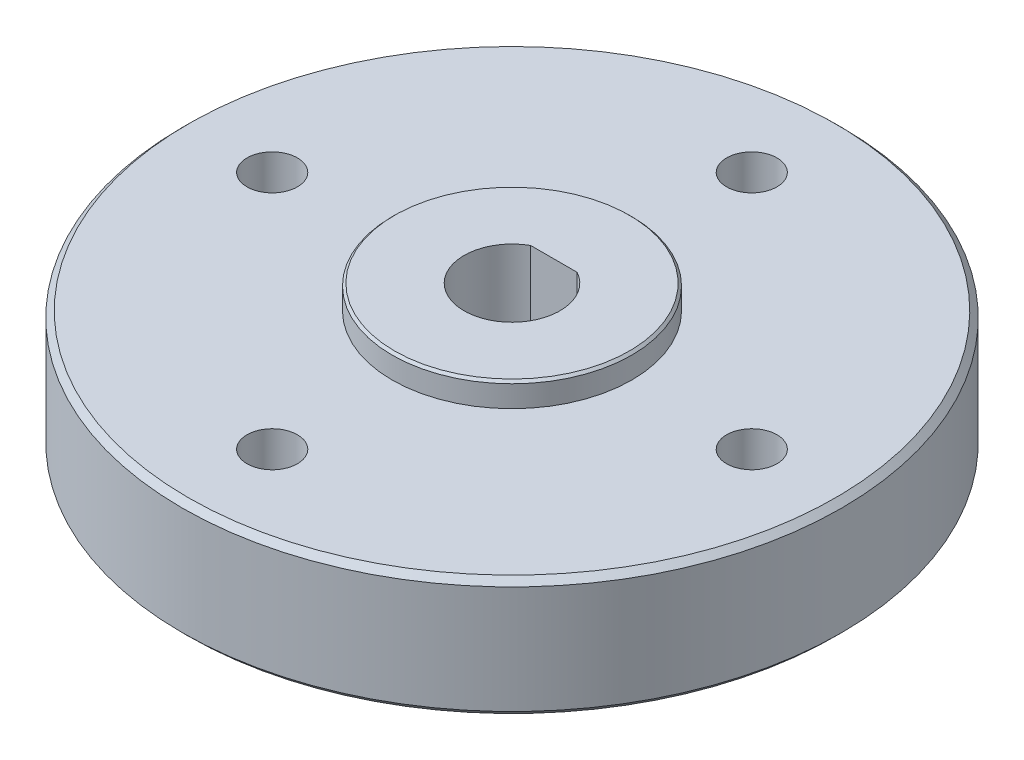
ISO-10303-21;
HEADER;
FILE_DESCRIPTION(('STEP AP214'),'2;1');
FILE_NAME('part.step','',(''),(''),'','','');
FILE_SCHEMA(('AUTOMOTIVE_DESIGN { 1 0 10303 214 1 1 1 1 }'));
ENDSEC;
DATA;
#1=APPLICATION_CONTEXT('core data for automotive mechanical design processes');
#2=APPLICATION_PROTOCOL_DEFINITION('international standard','automotive_design',2000,#1);
#3=PRODUCT_CONTEXT('',#1,'mechanical');
#4=PRODUCT('Part','Part','',(#3));
#5=PRODUCT_RELATED_PRODUCT_CATEGORY('part','',(#4));
#6=PRODUCT_DEFINITION_FORMATION('','',#4);
#7=PRODUCT_DEFINITION_CONTEXT('part definition',#1,'design');
#8=PRODUCT_DEFINITION('design','',#6,#7);
#9=PRODUCT_DEFINITION_SHAPE('','',#8);
#10=(LENGTH_UNIT() NAMED_UNIT(*) SI_UNIT(.MILLI.,.METRE.));
#11=(NAMED_UNIT(*) PLANE_ANGLE_UNIT() SI_UNIT($,.RADIAN.));
#12=(NAMED_UNIT(*) SI_UNIT($,.STERADIAN.) SOLID_ANGLE_UNIT());
#13=UNCERTAINTY_MEASURE_WITH_UNIT(LENGTH_MEASURE(1.E-05),#10,'distance_accuracy_value','');
#14=(GEOMETRIC_REPRESENTATION_CONTEXT(3) GLOBAL_UNCERTAINTY_ASSIGNED_CONTEXT((#13)) GLOBAL_UNIT_ASSIGNED_CONTEXT((#10,
#11,#12)) REPRESENTATION_CONTEXT('',''));
#15=CARTESIAN_POINT('',(0.,0.,0.));
#16=DIRECTION('',(0.,0.,1.));
#17=DIRECTION('',(1.,0.,0.));
#18=AXIS2_PLACEMENT_3D('',#15,#16,#17);
#19=CARTESIAN_POINT('',(0.,20.,0.));
#20=DIRECTION('',(0.,1.,0.));
#21=DIRECTION('',(0.,0.,1.));
#22=AXIS2_PLACEMENT_3D('',#19,#20,#21);
#23=PLANE('',#22);
#24=CARTESIAN_POINT('',(0.,20.,0.));
#25=DIRECTION('',(0.,1.,0.));
#26=DIRECTION('',(0.,0.,1.));
#27=AXIS2_PLACEMENT_3D('',#24,#25,#26);
#28=CIRCLE('',#27,27.);
#29=CARTESIAN_POINT('',(0.,20.,27.));
#30=VERTEX_POINT('',#29);
#31=EDGE_CURVE('E193',#30,#30,#28,.T.);
#32=ORIENTED_EDGE('',*,*,#31,.T.);
#33=EDGE_LOOP('',(#32));
#34=FACE_BOUND('',#33,.T.);
#35=CARTESIAN_POINT('',(20.,20.,2.09488880330588E-13));
#36=DIRECTION('',(0.,1.,0.));
#37=DIRECTION('',(0.,0.,1.));
#38=AXIS2_PLACEMENT_3D('',#35,#36,#37);
#39=CIRCLE('',#38,2.09999999999999);
#40=CARTESIAN_POINT('',(20.,20.,2.1000000000002));
#41=VERTEX_POINT('',#40);
#42=EDGE_CURVE('E430',#41,#41,#39,.T.);
#43=ORIENTED_EDGE('',*,*,#42,.F.);
#44=EDGE_LOOP('',(#43));
#45=FACE_BOUND('',#44,.T.);
#46=CARTESIAN_POINT('',(0.,20.,-20.));
#47=DIRECTION('',(0.,1.,0.));
#48=DIRECTION('',(0.,0.,1.));
#49=AXIS2_PLACEMENT_3D('',#46,#47,#48);
#50=CIRCLE('',#49,2.09999999999999);
#51=CARTESIAN_POINT('',(0.,20.,-17.9));
#52=VERTEX_POINT('',#51);
#53=EDGE_CURVE('E410',#52,#52,#50,.T.);
#54=ORIENTED_EDGE('',*,*,#53,.F.);
#55=EDGE_LOOP('',(#54));
#56=FACE_BOUND('',#55,.T.);
#57=CARTESIAN_POINT('',(-20.,20.,0.));
#58=DIRECTION('',(0.,1.,0.));
#59=DIRECTION('',(0.,0.,1.));
#60=AXIS2_PLACEMENT_3D('',#57,#58,#59);
#61=CIRCLE('',#60,2.09999999999999);
#62=CARTESIAN_POINT('',(-20.,20.,2.09999999999992));
#63=VERTEX_POINT('',#62);
#64=EDGE_CURVE('E412',#63,#63,#61,.T.);
#65=ORIENTED_EDGE('',*,*,#64,.F.);
#66=EDGE_LOOP('',(#65));
#67=FACE_BOUND('',#66,.T.);
#68=CARTESIAN_POINT('',(0.,20.,20.));
#69=DIRECTION('',(0.,1.,0.));
#70=DIRECTION('',(0.,0.,1.));
#71=AXIS2_PLACEMENT_3D('',#68,#69,#70);
#72=CIRCLE('',#71,2.09999999999999);
#73=CARTESIAN_POINT('',(0.,20.,22.1));
#74=VERTEX_POINT('',#73);
#75=EDGE_CURVE('E108',#74,#74,#72,.T.);
#76=ORIENTED_EDGE('',*,*,#75,.F.);
#77=EDGE_LOOP('',(#76));
#78=FACE_BOUND('',#77,.T.);
#79=CARTESIAN_POINT('',(0.,20.,0.));
#80=DIRECTION('',(0.,1.,0.));
#81=DIRECTION('',(0.,0.,1.));
#82=AXIS2_PLACEMENT_3D('',#79,#80,#81);
#83=CIRCLE('',#82,10.);
#84=CARTESIAN_POINT('',(0.,20.,10.));
#85=VERTEX_POINT('',#84);
#86=EDGE_CURVE('E100',#85,#85,#83,.T.);
#87=ORIENTED_EDGE('',*,*,#86,.F.);
#88=EDGE_LOOP('',(#87));
#89=FACE_BOUND('',#88,.T.);
#90=ADVANCED_FACE('F38',(#34,#45,#56,#67,#78,#89),#23,.T.);
#91=CARTESIAN_POINT('',(-1.93649167310371,10.,-3.5));
#92=DIRECTION('',(0.,0.,1.));
#93=DIRECTION('',(1.,0.,0.));
#94=AXIS2_PLACEMENT_3D('',#91,#92,#93);
#95=PLANE('',#94);
#96=CARTESIAN_POINT('',(0.,5.,-3.5));
#97=DIRECTION('',(0.,0.,1.));
#98=DIRECTION('',(1.,0.,0.));
#99=AXIS2_PLACEMENT_3D('',#96,#97,#98);
#100=CIRCLE('',#99,2.14999999999999);
#101=CARTESIAN_POINT('',(1.93649167310371,5.93407708461345,-3.5));
#102=VERTEX_POINT('',#101);
#103=CARTESIAN_POINT('',(-1.93649167310371,5.93407708461346,-3.5));
#104=VERTEX_POINT('',#103);
#105=EDGE_CURVE('E153',#102,#104,#100,.T.);
#106=ORIENTED_EDGE('',*,*,#105,.F.);
#107=DIRECTION('',(0.,-1.,0.));
#108=VECTOR('',#107,1.);
#109=CARTESIAN_POINT('',(1.93649167310371,10.,-3.5));
#110=LINE('',#109,#108);
#111=CARTESIAN_POINT('',(1.93649167310371,22.,-3.5));
#112=VERTEX_POINT('',#111);
#113=EDGE_CURVE('E97',#112,#102,#110,.T.);
#114=ORIENTED_EDGE('',*,*,#113,.F.);
#115=DIRECTION('',(-1.,0.,0.));
#116=VECTOR('',#115,1.);
#117=CARTESIAN_POINT('',(-1.93649167310371,22.,-3.5));
#118=LINE('',#117,#116);
#119=CARTESIAN_POINT('',(-1.93649167310371,22.,-3.5));
#120=VERTEX_POINT('',#119);
#121=EDGE_CURVE('E95',#112,#120,#118,.T.);
#122=ORIENTED_EDGE('',*,*,#121,.T.);
#123=DIRECTION('',(0.,-1.,0.));
#124=VECTOR('',#123,1.);
#125=CARTESIAN_POINT('',(-1.93649167310371,10.,-3.5));
#126=LINE('',#125,#124);
#127=EDGE_CURVE('E82',#120,#104,#126,.T.);
#128=ORIENTED_EDGE('',*,*,#127,.T.);
#129=EDGE_LOOP('',(#106,#114,#122,#128));
#130=FACE_BOUND('',#129,.T.);
#131=ADVANCED_FACE('F96',(#130),#95,.T.);
#132=CARTESIAN_POINT('',(0.,0.,0.));
#133=DIRECTION('',(0.,1.,0.));
#134=DIRECTION('',(0.,0.,1.));
#135=AXIS2_PLACEMENT_3D('',#132,#133,#134);
#136=PLANE('',#135);
#137=CARTESIAN_POINT('',(0.,0.,0.));
#138=DIRECTION('',(0.,1.,0.));
#139=DIRECTION('',(0.,0.,1.));
#140=AXIS2_PLACEMENT_3D('',#137,#138,#139);
#141=CIRCLE('',#140,9.49999999999999);
#142=CARTESIAN_POINT('',(0.,0.,9.49999999999999));
#143=VERTEX_POINT('',#142);
#144=EDGE_CURVE('E174',#143,#143,#141,.F.);
#145=ORIENTED_EDGE('',*,*,#144,.T.);
#146=EDGE_LOOP('',(#145));
#147=FACE_BOUND('',#146,.T.);
#148=CARTESIAN_POINT('',(0.,0.,0.));
#149=DIRECTION('',(0.,1.,0.));
#150=DIRECTION('',(0.,0.,1.));
#151=AXIS2_PLACEMENT_3D('',#148,#149,#150);
#152=CIRCLE('',#151,4.);
#153=CARTESIAN_POINT('',(-1.93649167310371,0.,-3.5));
#154=VERTEX_POINT('',#153);
#155=CARTESIAN_POINT('',(1.93649167310371,0.,-3.5));
#156=VERTEX_POINT('',#155);
#157=EDGE_CURVE('E152',#154,#156,#152,.T.);
#158=ORIENTED_EDGE('',*,*,#157,.T.);
#159=DIRECTION('',(-1.,0.,0.));
#160=VECTOR('',#159,1.);
#161=CARTESIAN_POINT('',(-1.93649167310371,0.,-3.5));
#162=LINE('',#161,#160);
#163=EDGE_CURVE('E157',#156,#154,#162,.T.);
#164=ORIENTED_EDGE('',*,*,#163,.T.);
#165=EDGE_LOOP('',(#158,#164));
#166=FACE_BOUND('',#165,.T.);
#167=ADVANCED_FACE('F216',(#147,#166),#136,.F.);
#168=CARTESIAN_POINT('',(0.,10.,0.));
#169=DIRECTION('',(0.,-1.,0.));
#170=DIRECTION('',(0.,0.,-1.));
#171=AXIS2_PLACEMENT_3D('',#168,#169,#170);
#172=CYLINDRICAL_SURFACE('',#171,10.);
#173=CARTESIAN_POINT('',(0.,0.500000000000006,0.));
#174=DIRECTION('',(0.,1.,0.));
#175=DIRECTION('',(0.,0.,1.));
#176=AXIS2_PLACEMENT_3D('',#173,#174,#175);
#177=CIRCLE('',#176,10.);
#178=CARTESIAN_POINT('',(0.,0.500000000000006,10.));
#179=VERTEX_POINT('',#178);
#180=EDGE_CURVE('E169',#179,#179,#177,.T.);
#181=ORIENTED_EDGE('',*,*,#180,.T.);
#182=EDGE_LOOP('',(#181));
#183=FACE_BOUND('',#182,.T.);
#184=CARTESIAN_POINT('',(0.,7.15,-10.));
#185=CARTESIAN_POINT('',(-0.1192951770477,7.14999585710749,-9.99999779415533));
#186=CARTESIAN_POINT('',(-0.238640878665695,7.14003763160128,-9.99784356192342));
#187=CARTESIAN_POINT('',(-0.473945707633434,7.10050718975858,-9.98945791684169));
#188=CARTESIAN_POINT('',(-0.589902294636688,7.07092063548379,-9.98322352359478));
#189=CARTESIAN_POINT('',(-0.814993934621842,6.99310035410295,-9.96737212131059));
#190=CARTESIAN_POINT('',(-0.924135859144616,6.94488577511426,-9.95775858667257));
#191=CARTESIAN_POINT('',(-1.1327765662227,6.83123806741441,-9.93618801207641));
#192=CARTESIAN_POINT('',(-1.2322756642465,6.76580550225614,-9.92423104882309));
#193=CARTESIAN_POINT('',(-1.42035649783211,6.61850318869663,-9.89907706769228));
#194=CARTESIAN_POINT('',(-1.50876697220246,6.53641730060487,-9.88586510432187));
#195=CARTESIAN_POINT('',(-1.67067633904749,6.35860260102536,-9.85979619733536));
#196=CARTESIAN_POINT('',(-1.74417393735181,6.26287260669995,-9.84693928461486));
#197=CARTESIAN_POINT('',(-1.87492136269551,6.05922790485009,-9.82288913451732));
#198=CARTESIAN_POINT('',(-1.93198989369503,5.95119433306611,-9.81171506495265));
#199=CARTESIAN_POINT('',(-2.02709660152008,5.72679080525574,-9.79250984047779));
#200=CARTESIAN_POINT('',(-2.06513697138726,5.61042181167499,-9.78447832340407));
#201=CARTESIAN_POINT('',(-2.12054358012287,5.37450544922573,-9.77261957638848));
#202=CARTESIAN_POINT('',(-2.13821248625045,5.25503231993136,-9.76873086311841));
#203=CARTESIAN_POINT('',(-2.1533155156109,5.01475909961162,-9.76541328155695));
#204=CARTESIAN_POINT('',(-2.15075203916927,4.89395916769324,-9.76598388422201));
#205=CARTESIAN_POINT('',(-2.12570687434355,4.65670409509444,-9.77146475946202));
#206=CARTESIAN_POINT('',(-2.10357582643306,4.54020990853523,-9.77629863270015));
#207=CARTESIAN_POINT('',(-2.04057883712934,4.31262745054,-9.78964070457862));
#208=CARTESIAN_POINT('',(-1.99971187656531,4.20153947354732,-9.79814910309933));
#209=CARTESIAN_POINT('',(-1.90007853397407,3.98693199900506,-9.81795740912599));
#210=CARTESIAN_POINT('',(-1.84117647440208,3.88347751294586,-9.82927834915201));
#211=CARTESIAN_POINT('',(-1.70724041387379,3.68779080405106,-9.85342313184556));
#212=CARTESIAN_POINT('',(-1.63220428443025,3.59556006442471,-9.86624717270804));
#213=CARTESIAN_POINT('',(-1.46626959681983,3.42291924400133,-9.89228166798259));
#214=CARTESIAN_POINT('',(-1.37507264554518,3.34279606498582,-9.90549460093341));
#215=CARTESIAN_POINT('',(-1.18038796671124,3.19893542906923,-9.93057408876429));
#216=CARTESIAN_POINT('',(-1.07690003090725,3.13519824985213,-9.94244062082578));
#217=CARTESIAN_POINT('',(-0.860227326790796,3.02585167910737,-9.96352676555221));
#218=CARTESIAN_POINT('',(-0.747023530831232,2.98027889303354,-9.97274102299816));
#219=CARTESIAN_POINT('',(-0.514323095052729,2.90888120607758,-9.98744446452808));
#220=CARTESIAN_POINT('',(-0.394827341247602,2.88305353265744,-9.9929341715879));
#221=CARTESIAN_POINT('',(-0.155396912233105,2.85229423013149,-9.99949586242373));
#222=CARTESIAN_POINT('',(-0.0355148095050641,2.84697054502326,-10.0006507216114));
#223=CARTESIAN_POINT('',(0.203425759392603,2.85630908786722,-9.99864441379693));
#224=CARTESIAN_POINT('',(0.322484278930411,2.87097000838981,-9.99548352913875));
#225=CARTESIAN_POINT('',(0.55510607579434,2.91953635346908,-9.98525310524442));
#226=CARTESIAN_POINT('',(0.668714084866189,2.95323706130785,-9.97822516539206));
#227=CARTESIAN_POINT('',(0.888665188300282,3.03869984038116,-9.96104688259782));
#228=CARTESIAN_POINT('',(0.995007677451121,3.09046341404838,-9.95089627992747));
#229=CARTESIAN_POINT('',(1.19903688916938,3.2114058256445,-9.92839371667258));
#230=CARTESIAN_POINT('',(1.29658316644176,3.28081616150451,-9.91601318724883));
#231=CARTESIAN_POINT('',(1.47878429433021,3.43477590729473,-9.89048411704561));
#232=CARTESIAN_POINT('',(1.56343752868901,3.51932721239387,-9.87733548026245));
#233=CARTESIAN_POINT('',(1.71899207342372,3.70296504506324,-9.85146727992684));
#234=CARTESIAN_POINT('',(1.78962236255015,3.80228310836099,-9.83875948862301));
#235=CARTESIAN_POINT('',(1.91320128109434,4.01160228707961,-9.81547916553194));
#236=CARTESIAN_POINT('',(1.96615066617779,4.12160294567668,-9.80490654249719));
#237=CARTESIAN_POINT('',(2.05251346118401,4.34858035758543,-9.7871923380041));
#238=CARTESIAN_POINT('',(2.08603524592224,4.46551432034695,-9.78003176342844));
#239=CARTESIAN_POINT('',(2.13291130108168,4.70352837927407,-9.76991683192509));
#240=CARTESIAN_POINT('',(2.14626867165145,4.82460783516892,-9.76696182842198));
#241=CARTESIAN_POINT('',(2.15230827721844,5.0647457227242,-9.76563237554938));
#242=CARTESIAN_POINT('',(2.14541990905902,5.18379303043583,-9.76716279185966));
#243=CARTESIAN_POINT('',(2.11212100134624,5.41898835302203,-9.77441711958147));
#244=CARTESIAN_POINT('',(2.08571067593955,5.53513639968568,-9.78014098499284));
#245=CARTESIAN_POINT('',(2.0143218042374,5.76090904318435,-9.7950916766133));
#246=CARTESIAN_POINT('',(1.96940373336637,5.87055356815906,-9.80430708612572));
#247=CARTESIAN_POINT('',(1.86232714806938,6.08081478583801,-9.82520738737324));
#248=CARTESIAN_POINT('',(1.80016690790408,6.18143057353649,-9.83689252627145));
#249=CARTESIAN_POINT('',(1.65893754489589,6.37289941291716,-9.86170127521134));
#250=CARTESIAN_POINT('',(1.57956155134348,6.46352309088062,-9.8748485453322));
#251=CARTESIAN_POINT('',(1.40677823664801,6.63030539035573,-9.90093904109967));
#252=CARTESIAN_POINT('',(1.31336768180881,6.70646066902949,-9.91388221896008));
#253=CARTESIAN_POINT('',(1.11376691656331,6.8430491434461,-9.93829697926319));
#254=CARTESIAN_POINT('',(1.00743216337325,6.90327493833702,-9.94974824871231));
#255=CARTESIAN_POINT('',(0.785927130589524,7.0049039825787,-9.96968604365291));
#256=CARTESIAN_POINT('',(0.670764474106681,7.04632326250048,-9.97817509269054));
#257=CARTESIAN_POINT('',(0.462880015300131,7.10164909329038,-9.98968941408702));
#258=CARTESIAN_POINT('',(0.371295625558987,7.11974656323162,-9.99353221017258));
#259=CARTESIAN_POINT('',(0.186484403739219,7.1439233863523,-9.99868831279962));
#260=CARTESIAN_POINT('',(0.093257640035486,7.15000323865882,-10.0000017243938));
#261=CARTESIAN_POINT('',(0.,7.15,-10.));
#262=B_SPLINE_CURVE_WITH_KNOTS('',3,(#184,#185,#186,#187,#188,#189,#190,#191,#192,#193,#194,
#195,#196,#197,#198,#199,#200,#201,#202,#203,#204,#205,#206,#207,#208,#209,#210,#211,#212,#213,
#214,#215,#216,#217,#218,#219,#220,#221,#222,#223,#224,#225,#226,#227,#228,#229,#230,#231,#232,
#233,#234,#235,#236,#237,#238,#239,#240,#241,#242,#243,#244,#245,#246,#247,#248,#249,#250,#251,
#252,#253,#254,#255,#256,#257,#258,#259,#260,#261),.UNSPECIFIED.,.T.,.F.,(4,2,2,2,2,2,2,2,2,2,2,
2,2,2,2,2,2,2,2,2,2,2,2,2,2,2,2,2,2,2,2,2,2,2,2,2,2,2,4),(0.,0.357544211686276,
0.715349887290345,1.07278874167704,1.43021589837477,1.79261875246883,2.1550530431969,
2.52134565162292,2.88759603420658,3.24833176368912,3.60902469691896,3.96338230803083,
4.31775919729574,4.67487043177504,5.03202880709288,5.39664182747473,5.76126102633378,
6.12661134647609,6.49191035600743,6.85018877759817,7.20844376108167,7.56291813942355,
7.9174220092589,8.27684076976283,8.63630454957634,9.00215424983876,9.36798831201723,
9.73176146117698,10.0954786768645,10.4515377658091,10.8075929490117,11.1624938076775,
11.5174302005908,11.8793070672842,12.2412674420736,12.607731278593,12.973882154198,
13.2533998611614,13.5329059586869),.UNSPECIFIED.);
#263=CARTESIAN_POINT('',(0.,7.15,-10.));
#264=VERTEX_POINT('',#263);
#265=EDGE_CURVE('E139',#264,#264,#262,.T.);
#266=ORIENTED_EDGE('',*,*,#265,.T.);
#267=EDGE_LOOP('',(#266));
#268=FACE_BOUND('',#267,.T.);
#269=CARTESIAN_POINT('',(0.,10.,0.));
#270=DIRECTION('',(0.,1.,0.));
#271=DIRECTION('',(0.,0.,1.));
#272=AXIS2_PLACEMENT_3D('',#269,#270,#271);
#273=CIRCLE('',#272,10.);
#274=CARTESIAN_POINT('',(0.,10.,10.));
#275=VERTEX_POINT('',#274);
#276=EDGE_CURVE('E162',#275,#275,#273,.T.);
#277=ORIENTED_EDGE('',*,*,#276,.F.);
#278=EDGE_LOOP('',(#277));
#279=FACE_BOUND('',#278,.T.);
#280=ADVANCED_FACE('F327',(#183,#268,#279),#172,.T.);
#281=CARTESIAN_POINT('',(0.,10.,0.));
#282=DIRECTION('',(0.,-1.,0.));
#283=DIRECTION('',(0.,0.,-1.));
#284=AXIS2_PLACEMENT_3D('',#281,#282,#283);
#285=CYLINDRICAL_SURFACE('',#284,4.);
#286=CARTESIAN_POINT('',(-1.93649167310371,5.93407708461346,-3.5));
#287=CARTESIAN_POINT('',(-1.95932238412544,5.88673923669466,-3.48736698818151));
#288=CARTESIAN_POINT('',(-1.98048105130827,5.8384406928552,-3.47537003089558));
#289=CARTESIAN_POINT('',(-2.01930710362112,5.74006959394772,-3.45295550474818));
#290=CARTESIAN_POINT('',(-2.03697220519197,5.6899959036079,-3.44253896995404));
#291=CARTESIAN_POINT('',(-2.08437524322585,5.53771498923545,-3.41419867972922));
#292=CARTESIAN_POINT('',(-2.1086515464058,5.43317866768657,-3.3991093984043));
#293=CARTESIAN_POINT('',(-2.1414197773504,5.22019258602493,-3.37856674532261));
#294=CARTESIAN_POINT('',(-2.14983384582117,5.11172617206654,-3.37316091089174));
#295=CARTESIAN_POINT('',(-2.15016126595105,4.89475755725652,-3.37295219509262));
#296=CARTESIAN_POINT('',(-2.14207443796493,4.78625535602814,-3.37814942915997));
#297=CARTESIAN_POINT('',(-2.10977992981609,4.57207905192266,-3.39840827336277));
#298=CARTESIAN_POINT('',(-2.08549224760204,4.46642170456744,-3.41351883072518));
#299=CARTESIAN_POINT('',(-2.03784059872736,4.31252999324153,-3.44202543163661));
#300=CARTESIAN_POINT('',(-2.02005178184791,4.26192652170431,-3.45252110793181));
#301=CARTESIAN_POINT('',(-1.98090616267468,4.16253054419986,-3.47512896548307));
#302=CARTESIAN_POINT('',(-1.95955179063251,4.11373683221405,-3.48724004457111));
#303=CARTESIAN_POINT('',(-1.93649167310371,4.06592291538654,-3.5));
#304=B_SPLINE_CURVE_WITH_KNOTS('',3,(#286,#287,#288,#289,#290,#291,#292,#293,#294,#295,#296,
#297,#298,#299,#300,#301,#302,#303),.UNSPECIFIED.,.F.,.F.,(4,2,2,2,2,2,2,2,4),(0.,
0.162085979062148,0.324277557510429,0.647745786786127,0.972797657339555,1.29785306675099,
1.62452564639568,1.78835084678442,1.95206483776703),.UNSPECIFIED.);
#305=CARTESIAN_POINT('',(-1.93649167310371,4.06592291538654,-3.5));
#306=VERTEX_POINT('',#305);
#307=EDGE_CURVE('E89',#104,#306,#304,.T.);
#308=ORIENTED_EDGE('',*,*,#307,.F.);
#309=ORIENTED_EDGE('',*,*,#127,.F.);
#310=CARTESIAN_POINT('',(0.,22.,0.));
#311=DIRECTION('',(0.,1.,0.));
#312=DIRECTION('',(0.,0.,1.));
#313=AXIS2_PLACEMENT_3D('',#310,#311,#312);
#314=CIRCLE('',#313,4.);
#315=EDGE_CURVE('E87',#120,#112,#314,.T.);
#316=ORIENTED_EDGE('',*,*,#315,.T.);
#317=ORIENTED_EDGE('',*,*,#113,.T.);
#318=CARTESIAN_POINT('',(1.93649167310371,4.06592291538655,-3.5));
#319=CARTESIAN_POINT('',(1.95932238412544,4.11326076330534,-3.48736698818151));
#320=CARTESIAN_POINT('',(1.98048105130827,4.16155930714481,-3.47537003089558));
#321=CARTESIAN_POINT('',(2.01930710362112,4.25993040605228,-3.45295550474818));
#322=CARTESIAN_POINT('',(2.03697220519197,4.3100040963921,-3.44253896995404));
#323=CARTESIAN_POINT('',(2.08437524322585,4.46228501076455,-3.41419867972922));
#324=CARTESIAN_POINT('',(2.1086515464058,4.56682133231343,-3.3991093984043));
#325=CARTESIAN_POINT('',(2.1414197773504,4.77980741397508,-3.37856674532262));
#326=CARTESIAN_POINT('',(2.14983384582117,4.88827382793346,-3.37316091089174));
#327=CARTESIAN_POINT('',(2.15016126595105,5.10524244274348,-3.37295219509262));
#328=CARTESIAN_POINT('',(2.14207443796493,5.21374464397186,-3.37814942915997));
#329=CARTESIAN_POINT('',(2.10977992981608,5.42792094807734,-3.39840827336277));
#330=CARTESIAN_POINT('',(2.08549224760204,5.53357829543257,-3.41351883072518));
#331=CARTESIAN_POINT('',(2.03784059872735,5.68747000675847,-3.44202543163661));
#332=CARTESIAN_POINT('',(2.02005178184791,5.73807347829569,-3.45252110793181));
#333=CARTESIAN_POINT('',(1.98090616267468,5.83746945580014,-3.47512896548307));
#334=CARTESIAN_POINT('',(1.95955179063251,5.88626316778595,-3.48724004457111));
#335=CARTESIAN_POINT('',(1.93649167310371,5.93407708461345,-3.5));
#336=B_SPLINE_CURVE_WITH_KNOTS('',3,(#318,#319,#320,#321,#322,#323,#324,#325,#326,#327,#328,
#329,#330,#331,#332,#333,#334,#335),.UNSPECIFIED.,.F.,.F.,(4,2,2,2,2,2,2,2,4),(0.,
0.162085979062148,0.324277557510427,0.647745786786127,0.972797657339554,1.29785306675099,
1.62452564639568,1.78835084678441,1.95206483776702),.UNSPECIFIED.);
#337=CARTESIAN_POINT('',(1.93649167310371,4.06592291538655,-3.5));
#338=VERTEX_POINT('',#337);
#339=EDGE_CURVE('E115',#338,#102,#336,.T.);
#340=ORIENTED_EDGE('',*,*,#339,.F.);
#341=EDGE_CURVE('E93',#338,#156,#110,.T.);
#342=ORIENTED_EDGE('',*,*,#341,.T.);
#343=ORIENTED_EDGE('',*,*,#157,.F.);
#344=EDGE_CURVE('E61',#306,#154,#126,.T.);
#345=ORIENTED_EDGE('',*,*,#344,.F.);
#346=EDGE_LOOP('',(#308,#309,#316,#317,#340,#342,#343,#345));
#347=FACE_BOUND('',#346,.T.);
#348=ADVANCED_FACE('F84',(#347),#285,.F.);
#349=EDGE_CURVE('E54',#306,#338,#100,.T.);
#350=ORIENTED_EDGE('',*,*,#349,.F.);
#351=ORIENTED_EDGE('',*,*,#344,.T.);
#352=ORIENTED_EDGE('',*,*,#163,.F.);
#353=ORIENTED_EDGE('',*,*,#341,.F.);
#354=EDGE_LOOP('',(#350,#351,#352,#353));
#355=FACE_BOUND('',#354,.T.);
#356=ADVANCED_FACE('F133',(#355),#95,.T.);
#357=CARTESIAN_POINT('',(0.,5.,-10.));
#358=DIRECTION('',(0.,0.,-1.));
#359=DIRECTION('',(-1.,0.,0.));
#360=AXIS2_PLACEMENT_3D('',#357,#358,#359);
#361=CYLINDRICAL_SURFACE('',#360,2.14999999999999);
#362=ORIENTED_EDGE('',*,*,#307,.T.);
#363=ORIENTED_EDGE('',*,*,#349,.T.);
#364=ORIENTED_EDGE('',*,*,#339,.T.);
#365=ORIENTED_EDGE('',*,*,#105,.T.);
#366=EDGE_LOOP('',(#362,#363,#364,#365));
#367=FACE_BOUND('',#366,.T.);
#368=ORIENTED_EDGE('',*,*,#265,.F.);
#369=EDGE_LOOP('',(#368));
#370=FACE_BOUND('',#369,.T.);
#371=ADVANCED_FACE('F128',(#367,#370),#361,.F.);
#372=CARTESIAN_POINT('',(0.,10.,0.));
#373=DIRECTION('',(0.,1.,0.));
#374=DIRECTION('',(0.,0.,1.));
#375=AXIS2_PLACEMENT_3D('',#372,#373,#374);
#376=PLANE('',#375);
#377=CARTESIAN_POINT('',(0.,10.,0.));
#378=DIRECTION('',(0.,1.,0.));
#379=DIRECTION('',(0.,0.,1.));
#380=AXIS2_PLACEMENT_3D('',#377,#378,#379);
#381=CIRCLE('',#380,27.);
#382=CARTESIAN_POINT('',(0.,10.,27.));
#383=VERTEX_POINT('',#382);
#384=EDGE_CURVE('E189',#383,#383,#381,.F.);
#385=ORIENTED_EDGE('',*,*,#384,.T.);
#386=EDGE_LOOP('',(#385));
#387=FACE_BOUND('',#386,.T.);
#388=CARTESIAN_POINT('',(20.,10.,2.09488880330588E-13));
#389=DIRECTION('',(0.,1.,0.));
#390=DIRECTION('',(0.,0.,1.));
#391=AXIS2_PLACEMENT_3D('',#388,#389,#390);
#392=CIRCLE('',#391,2.09999999999999);
#393=CARTESIAN_POINT('',(20.,10.,2.1000000000002));
#394=VERTEX_POINT('',#393);
#395=EDGE_CURVE('E232',#394,#394,#392,.T.);
#396=ORIENTED_EDGE('',*,*,#395,.T.);
#397=EDGE_LOOP('',(#396));
#398=FACE_BOUND('',#397,.T.);
#399=CARTESIAN_POINT('',(0.,10.,-20.));
#400=DIRECTION('',(0.,1.,0.));
#401=DIRECTION('',(0.,0.,1.));
#402=AXIS2_PLACEMENT_3D('',#399,#400,#401);
#403=CIRCLE('',#402,2.09999999999999);
#404=CARTESIAN_POINT('',(0.,10.,-17.9));
#405=VERTEX_POINT('',#404);
#406=EDGE_CURVE('E236',#405,#405,#403,.T.);
#407=ORIENTED_EDGE('',*,*,#406,.T.);
#408=EDGE_LOOP('',(#407));
#409=FACE_BOUND('',#408,.T.);
#410=CARTESIAN_POINT('',(-20.,10.,0.));
#411=DIRECTION('',(0.,1.,0.));
#412=DIRECTION('',(0.,0.,1.));
#413=AXIS2_PLACEMENT_3D('',#410,#411,#412);
#414=CIRCLE('',#413,2.09999999999999);
#415=CARTESIAN_POINT('',(-20.,10.,2.09999999999992));
#416=VERTEX_POINT('',#415);
#417=EDGE_CURVE('E240',#416,#416,#414,.T.);
#418=ORIENTED_EDGE('',*,*,#417,.T.);
#419=EDGE_LOOP('',(#418));
#420=FACE_BOUND('',#419,.T.);
#421=CARTESIAN_POINT('',(0.,10.,20.));
#422=DIRECTION('',(0.,1.,0.));
#423=DIRECTION('',(0.,0.,1.));
#424=AXIS2_PLACEMENT_3D('',#421,#422,#423);
#425=CIRCLE('',#424,2.09999999999999);
#426=CARTESIAN_POINT('',(0.,10.,22.1));
#427=VERTEX_POINT('',#426);
#428=EDGE_CURVE('E104',#427,#427,#425,.T.);
#429=ORIENTED_EDGE('',*,*,#428,.T.);
#430=EDGE_LOOP('',(#429));
#431=FACE_BOUND('',#430,.T.);
#432=ORIENTED_EDGE('',*,*,#276,.T.);
#433=EDGE_LOOP('',(#432));
#434=FACE_BOUND('',#433,.T.);
#435=ADVANCED_FACE('F132',(#387,#398,#409,#420,#431,#434),#376,.F.);
#436=CARTESIAN_POINT('',(0.,20.,0.));
#437=DIRECTION('',(0.,-1.,0.));
#438=DIRECTION('',(0.,0.,-1.));
#439=AXIS2_PLACEMENT_3D('',#436,#437,#438);
#440=CYLINDRICAL_SURFACE('',#439,27.5);
#441=CARTESIAN_POINT('',(0.,10.5,0.));
#442=DIRECTION('',(0.,1.,0.));
#443=DIRECTION('',(0.,0.,1.));
#444=AXIS2_PLACEMENT_3D('',#441,#442,#443);
#445=CIRCLE('',#444,27.5);
#446=CARTESIAN_POINT('',(0.,10.5,27.5));
#447=VERTEX_POINT('',#446);
#448=EDGE_CURVE('E185',#447,#447,#445,.T.);
#449=ORIENTED_EDGE('',*,*,#448,.T.);
#450=EDGE_LOOP('',(#449));
#451=FACE_BOUND('',#450,.T.);
#452=CARTESIAN_POINT('',(0.,19.5,0.));
#453=DIRECTION('',(0.,1.,0.));
#454=DIRECTION('',(0.,0.,1.));
#455=AXIS2_PLACEMENT_3D('',#452,#453,#454);
#456=CIRCLE('',#455,27.5);
#457=CARTESIAN_POINT('',(0.,19.5,27.5));
#458=VERTEX_POINT('',#457);
#459=EDGE_CURVE('E179',#458,#458,#456,.F.);
#460=ORIENTED_EDGE('',*,*,#459,.T.);
#461=EDGE_LOOP('',(#460));
#462=FACE_BOUND('',#461,.T.);
#463=ADVANCED_FACE('F134',(#451,#462),#440,.T.);
#464=CARTESIAN_POINT('',(0.,22.,0.));
#465=DIRECTION('',(0.,1.,0.));
#466=DIRECTION('',(0.,0.,1.));
#467=AXIS2_PLACEMENT_3D('',#464,#465,#466);
#468=PLANE('',#467);
#469=CARTESIAN_POINT('',(0.,22.,0.));
#470=DIRECTION('',(0.,1.,0.));
#471=DIRECTION('',(0.,0.,1.));
#472=AXIS2_PLACEMENT_3D('',#469,#470,#471);
#473=CIRCLE('',#472,9.80000000000002);
#474=CARTESIAN_POINT('',(0.,22.,9.80000000000002));
#475=VERTEX_POINT('',#474);
#476=EDGE_CURVE('E47',#475,#475,#473,.T.);
#477=ORIENTED_EDGE('',*,*,#476,.T.);
#478=EDGE_LOOP('',(#477));
#479=FACE_BOUND('',#478,.T.);
#480=ORIENTED_EDGE('',*,*,#121,.F.);
#481=ORIENTED_EDGE('',*,*,#315,.F.);
#482=EDGE_LOOP('',(#480,#481));
#483=FACE_BOUND('',#482,.T.);
#484=ADVANCED_FACE('F102',(#479,#483),#468,.T.);
#485=CARTESIAN_POINT('',(0.,22.,0.));
#486=DIRECTION('',(0.,-1.,0.));
#487=DIRECTION('',(0.,0.,-1.));
#488=AXIS2_PLACEMENT_3D('',#485,#486,#487);
#489=CYLINDRICAL_SURFACE('',#488,10.);
#490=CARTESIAN_POINT('',(0.,21.8,0.));
#491=DIRECTION('',(0.,1.,0.));
#492=DIRECTION('',(0.,0.,1.));
#493=AXIS2_PLACEMENT_3D('',#490,#491,#492);
#494=CIRCLE('',#493,10.);
#495=CARTESIAN_POINT('',(0.,21.8,10.));
#496=VERTEX_POINT('',#495);
#497=EDGE_CURVE('E11',#496,#496,#494,.F.);
#498=ORIENTED_EDGE('',*,*,#497,.T.);
#499=EDGE_LOOP('',(#498));
#500=FACE_BOUND('',#499,.T.);
#501=ORIENTED_EDGE('',*,*,#86,.T.);
#502=EDGE_LOOP('',(#501));
#503=FACE_BOUND('',#502,.T.);
#504=ADVANCED_FACE('F219',(#500,#503),#489,.T.);
#505=CARTESIAN_POINT('',(0.,20.,20.));
#506=DIRECTION('',(0.,1.,0.));
#507=DIRECTION('',(0.,0.,1.));
#508=AXIS2_PLACEMENT_3D('',#505,#506,#507);
#509=CYLINDRICAL_SURFACE('',#508,2.09999999999999);
#510=ORIENTED_EDGE('',*,*,#75,.T.);
#511=EDGE_LOOP('',(#510));
#512=FACE_BOUND('',#511,.T.);
#513=ORIENTED_EDGE('',*,*,#428,.F.);
#514=EDGE_LOOP('',(#513));
#515=FACE_BOUND('',#514,.T.);
#516=ADVANCED_FACE('F243',(#512,#515),#509,.F.);
#517=CARTESIAN_POINT('',(-20.,20.,0.));
#518=DIRECTION('',(0.,1.,0.));
#519=DIRECTION('',(0.,0.,1.));
#520=AXIS2_PLACEMENT_3D('',#517,#518,#519);
#521=CYLINDRICAL_SURFACE('',#520,2.09999999999999);
#522=ORIENTED_EDGE('',*,*,#64,.T.);
#523=EDGE_LOOP('',(#522));
#524=FACE_BOUND('',#523,.T.);
#525=ORIENTED_EDGE('',*,*,#417,.F.);
#526=EDGE_LOOP('',(#525));
#527=FACE_BOUND('',#526,.T.);
#528=ADVANCED_FACE('F245',(#524,#527),#521,.F.);
#529=CARTESIAN_POINT('',(0.,20.,-20.));
#530=DIRECTION('',(0.,1.,0.));
#531=DIRECTION('',(0.,0.,1.));
#532=AXIS2_PLACEMENT_3D('',#529,#530,#531);
#533=CYLINDRICAL_SURFACE('',#532,2.09999999999999);
#534=ORIENTED_EDGE('',*,*,#53,.T.);
#535=EDGE_LOOP('',(#534));
#536=FACE_BOUND('',#535,.T.);
#537=ORIENTED_EDGE('',*,*,#406,.F.);
#538=EDGE_LOOP('',(#537));
#539=FACE_BOUND('',#538,.T.);
#540=ADVANCED_FACE('F252',(#536,#539),#533,.F.);
#541=CARTESIAN_POINT('',(20.,20.,2.09488880330588E-13));
#542=DIRECTION('',(0.,1.,0.));
#543=DIRECTION('',(0.,0.,1.));
#544=AXIS2_PLACEMENT_3D('',#541,#542,#543);
#545=CYLINDRICAL_SURFACE('',#544,2.09999999999999);
#546=ORIENTED_EDGE('',*,*,#42,.T.);
#547=EDGE_LOOP('',(#546));
#548=FACE_BOUND('',#547,.T.);
#549=ORIENTED_EDGE('',*,*,#395,.F.);
#550=EDGE_LOOP('',(#549));
#551=FACE_BOUND('',#550,.T.);
#552=ADVANCED_FACE('F296',(#548,#551),#545,.F.);
#553=CARTESIAN_POINT('',(0.,0.500000000000006,0.));
#554=DIRECTION('',(0.,1.,0.));
#555=DIRECTION('',(0.,0.,1.));
#556=AXIS2_PLACEMENT_3D('',#553,#554,#555);
#557=CONICAL_SURFACE('',#556,10.,0.785398163397448);
#558=ORIENTED_EDGE('',*,*,#144,.F.);
#559=EDGE_LOOP('',(#558));
#560=FACE_BOUND('',#559,.T.);
#561=ORIENTED_EDGE('',*,*,#180,.F.);
#562=EDGE_LOOP('',(#561));
#563=FACE_BOUND('',#562,.T.);
#564=ADVANCED_FACE('F287',(#560,#563),#557,.T.);
#565=CARTESIAN_POINT('',(0.,10.5,0.));
#566=DIRECTION('',(0.,1.,0.));
#567=DIRECTION('',(0.,0.,1.));
#568=AXIS2_PLACEMENT_3D('',#565,#566,#567);
#569=CONICAL_SURFACE('',#568,27.5,0.785398163397445);
#570=ORIENTED_EDGE('',*,*,#384,.F.);
#571=EDGE_LOOP('',(#570));
#572=FACE_BOUND('',#571,.T.);
#573=ORIENTED_EDGE('',*,*,#448,.F.);
#574=EDGE_LOOP('',(#573));
#575=FACE_BOUND('',#574,.T.);
#576=ADVANCED_FACE('F207',(#572,#575),#569,.T.);
#577=CARTESIAN_POINT('',(0.,20.,0.));
#578=DIRECTION('',(0.,-1.,0.));
#579=DIRECTION('',(0.,0.,-1.));
#580=AXIS2_PLACEMENT_3D('',#577,#578,#579);
#581=CONICAL_SURFACE('',#580,27.,0.785398163397434);
#582=ORIENTED_EDGE('',*,*,#459,.F.);
#583=EDGE_LOOP('',(#582));
#584=FACE_BOUND('',#583,.T.);
#585=ORIENTED_EDGE('',*,*,#31,.F.);
#586=EDGE_LOOP('',(#585));
#587=FACE_BOUND('',#586,.T.);
#588=ADVANCED_FACE('F202',(#584,#587),#581,.T.);
#589=CARTESIAN_POINT('',(0.,22.,0.));
#590=DIRECTION('',(0.,-1.,0.));
#591=DIRECTION('',(0.,0.,-1.));
#592=AXIS2_PLACEMENT_3D('',#589,#590,#591);
#593=CONICAL_SURFACE('',#592,9.80000000000002,0.785398163397427);
#594=ORIENTED_EDGE('',*,*,#497,.F.);
#595=EDGE_LOOP('',(#594));
#596=FACE_BOUND('',#595,.T.);
#597=ORIENTED_EDGE('',*,*,#476,.F.);
#598=EDGE_LOOP('',(#597));
#599=FACE_BOUND('',#598,.T.);
#600=ADVANCED_FACE('F40',(#596,#599),#593,.T.);
#601=CLOSED_SHELL('',(#90,#131,#167,#280,#348,#356,#371,#435,#463,#484,#504,#516,#528,#540,#552,
#564,#576,#588,#600));
#602=MANIFOLD_SOLID_BREP('B2',#601);
#603=ADVANCED_BREP_SHAPE_REPRESENTATION('',(#18,#602),#14);
#604=SHAPE_DEFINITION_REPRESENTATION(#9,#603);
ENDSEC;
END-ISO-10303-21;
